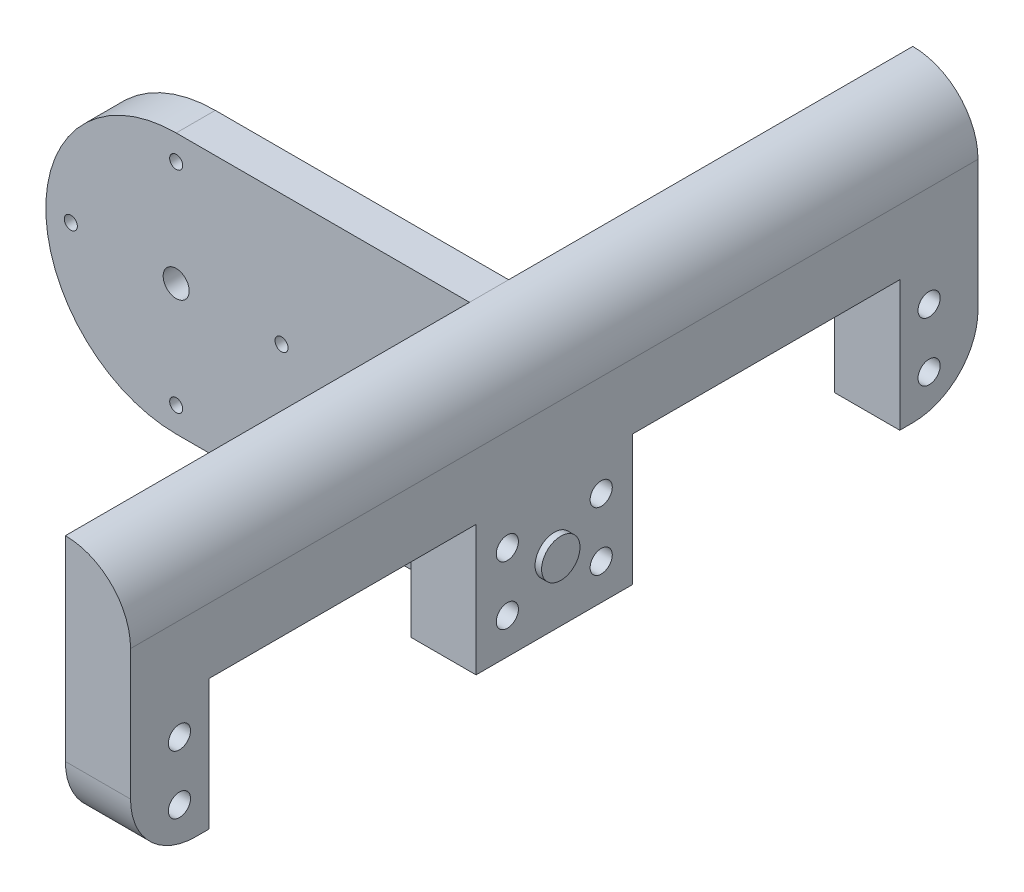
ISO-10303-21;
HEADER;
FILE_DESCRIPTION(('STEP AP214'),'2;1');
FILE_NAME('part.step','',(''),(''),'','','');
FILE_SCHEMA(('AUTOMOTIVE_DESIGN { 1 0 10303 214 1 1 1 1 }'));
ENDSEC;
DATA;
#1=APPLICATION_CONTEXT('core data for automotive mechanical design processes');
#2=APPLICATION_PROTOCOL_DEFINITION('international standard','automotive_design',2000,#1);
#3=PRODUCT_CONTEXT('',#1,'mechanical');
#4=PRODUCT('Part','Part','',(#3));
#5=PRODUCT_RELATED_PRODUCT_CATEGORY('part','',(#4));
#6=PRODUCT_DEFINITION_FORMATION('','',#4);
#7=PRODUCT_DEFINITION_CONTEXT('part definition',#1,'design');
#8=PRODUCT_DEFINITION('design','',#6,#7);
#9=PRODUCT_DEFINITION_SHAPE('','',#8);
#10=(LENGTH_UNIT() NAMED_UNIT(*) SI_UNIT(.MILLI.,.METRE.));
#11=(NAMED_UNIT(*) PLANE_ANGLE_UNIT() SI_UNIT($,.RADIAN.));
#12=(NAMED_UNIT(*) SI_UNIT($,.STERADIAN.) SOLID_ANGLE_UNIT());
#13=UNCERTAINTY_MEASURE_WITH_UNIT(LENGTH_MEASURE(1.E-05),#10,'distance_accuracy_value','');
#14=(GEOMETRIC_REPRESENTATION_CONTEXT(3) GLOBAL_UNCERTAINTY_ASSIGNED_CONTEXT((#13)) GLOBAL_UNIT_ASSIGNED_CONTEXT((#10,
#11,#12)) REPRESENTATION_CONTEXT('',''));
#15=CARTESIAN_POINT('',(0.,0.,0.));
#16=DIRECTION('',(0.,0.,1.));
#17=DIRECTION('',(1.,0.,0.));
#18=AXIS2_PLACEMENT_3D('',#15,#16,#17);
#19=CARTESIAN_POINT('',(55.,0.,0.));
#20=DIRECTION('',(-1.,0.,0.));
#21=DIRECTION('',(0.,0.,1.));
#22=AXIS2_PLACEMENT_3D('',#19,#20,#21);
#23=PLANE('',#22);
#24=CARTESIAN_POINT('',(55.,-9.99999999999046,-4.16680578929673E-12));
#25=DIRECTION('',(-1.,0.,0.));
#26=DIRECTION('',(0.,0.,1.));
#27=AXIS2_PLACEMENT_3D('',#24,#25,#26);
#28=CIRCLE('',#27,2.94441964631571);
#29=CARTESIAN_POINT('',(55.,-9.99999999999046,2.94441964631154));
#30=VERTEX_POINT('',#29);
#31=EDGE_CURVE('E11',#30,#30,#28,.F.);
#32=ORIENTED_EDGE('',*,*,#31,.F.);
#33=EDGE_LOOP('',(#32));
#34=FACE_BOUND('',#33,.T.);
#35=CARTESIAN_POINT('',(55.,-14.5,-7.20000000000033));
#36=DIRECTION('',(1.,0.,0.));
#37=DIRECTION('',(0.,0.,-1.));
#38=AXIS2_PLACEMENT_3D('',#35,#36,#37);
#39=CIRCLE('',#38,1.69999999999999);
#40=CARTESIAN_POINT('',(55.,-14.5,-8.90000000000032));
#41=VERTEX_POINT('',#40);
#42=EDGE_CURVE('E714',#41,#41,#39,.T.);
#43=ORIENTED_EDGE('',*,*,#42,.F.);
#44=EDGE_LOOP('',(#43));
#45=FACE_BOUND('',#44,.T.);
#46=DIRECTION('',(0.,0.,-1.));
#47=VECTOR('',#46,1.);
#48=CARTESIAN_POINT('',(55.,-20.,-65.));
#49=LINE('',#48,#47);
#50=CARTESIAN_POINT('',(55.,-20.,-53.));
#51=VERTEX_POINT('',#50);
#52=CARTESIAN_POINT('',(55.,-20.,-55.));
#53=VERTEX_POINT('',#52);
#54=EDGE_CURVE('E234',#51,#53,#49,.T.);
#55=ORIENTED_EDGE('',*,*,#54,.T.);
#56=CARTESIAN_POINT('',(55.,-9.99999999999997,-55.));
#57=DIRECTION('',(-1.,0.,0.));
#58=DIRECTION('',(0.,0.,1.));
#59=AXIS2_PLACEMENT_3D('',#56,#57,#58);
#60=CIRCLE('',#59,10.);
#61=CARTESIAN_POINT('',(55.,-9.99999999999997,-65.));
#62=VERTEX_POINT('',#61);
#63=EDGE_CURVE('E322',#53,#62,#60,.F.);
#64=ORIENTED_EDGE('',*,*,#63,.T.);
#65=DIRECTION('',(0.,1.,0.));
#66=VECTOR('',#65,1.);
#67=CARTESIAN_POINT('',(55.,20.,-65.));
#68=LINE('',#67,#66);
#69=CARTESIAN_POINT('',(55.,9.99999999999998,-65.));
#70=VERTEX_POINT('',#69);
#71=EDGE_CURVE('E165',#62,#70,#68,.T.);
#72=ORIENTED_EDGE('',*,*,#71,.T.);
#73=DIRECTION('',(0.,0.,1.));
#74=VECTOR('',#73,1.);
#75=CARTESIAN_POINT('',(55.,9.99999999999998,65.));
#76=LINE('',#75,#74);
#77=CARTESIAN_POINT('',(55.,9.99999999999998,65.));
#78=VERTEX_POINT('',#77);
#79=EDGE_CURVE('E302',#70,#78,#76,.T.);
#80=ORIENTED_EDGE('',*,*,#79,.T.);
#81=DIRECTION('',(0.,-1.,0.));
#82=VECTOR('',#81,1.);
#83=CARTESIAN_POINT('',(55.,20.,65.));
#84=LINE('',#83,#82);
#85=CARTESIAN_POINT('',(55.,-9.99999999999997,65.));
#86=VERTEX_POINT('',#85);
#87=EDGE_CURVE('E231',#78,#86,#84,.T.);
#88=ORIENTED_EDGE('',*,*,#87,.T.);
#89=CARTESIAN_POINT('',(55.,-9.99999999999997,55.));
#90=DIRECTION('',(-1.,0.,0.));
#91=DIRECTION('',(0.,0.,1.));
#92=AXIS2_PLACEMENT_3D('',#89,#90,#91);
#93=CIRCLE('',#92,10.);
#94=CARTESIAN_POINT('',(55.,-20.,55.));
#95=VERTEX_POINT('',#94);
#96=EDGE_CURVE('E320',#86,#95,#93,.F.);
#97=ORIENTED_EDGE('',*,*,#96,.T.);
#98=CARTESIAN_POINT('',(55.,-20.,53.));
#99=VERTEX_POINT('',#98);
#100=EDGE_CURVE('E235',#95,#99,#49,.T.);
#101=ORIENTED_EDGE('',*,*,#100,.T.);
#102=DIRECTION('',(0.,-1.,0.));
#103=VECTOR('',#102,1.);
#104=CARTESIAN_POINT('',(55.,-20.,53.));
#105=LINE('',#104,#103);
#106=CARTESIAN_POINT('',(55.,0.,53.));
#107=VERTEX_POINT('',#106);
#108=EDGE_CURVE('E176',#107,#99,#105,.T.);
#109=ORIENTED_EDGE('',*,*,#108,.F.);
#110=DIRECTION('',(0.,0.,1.));
#111=VECTOR('',#110,1.);
#112=CARTESIAN_POINT('',(55.,0.,53.));
#113=LINE('',#112,#111);
#114=CARTESIAN_POINT('',(55.,0.,12.));
#115=VERTEX_POINT('',#114);
#116=EDGE_CURVE('E184',#115,#107,#113,.T.);
#117=ORIENTED_EDGE('',*,*,#116,.F.);
#118=DIRECTION('',(0.,1.,0.));
#119=VECTOR('',#118,1.);
#120=CARTESIAN_POINT('',(55.,-20.,12.));
#121=LINE('',#120,#119);
#122=CARTESIAN_POINT('',(55.,-20.,12.));
#123=VERTEX_POINT('',#122);
#124=EDGE_CURVE('E188',#123,#115,#121,.T.);
#125=ORIENTED_EDGE('',*,*,#124,.F.);
#126=CARTESIAN_POINT('',(55.,-20.,-12.));
#127=VERTEX_POINT('',#126);
#128=EDGE_CURVE('E238',#123,#127,#49,.T.);
#129=ORIENTED_EDGE('',*,*,#128,.T.);
#130=DIRECTION('',(0.,-1.,0.));
#131=VECTOR('',#130,1.);
#132=CARTESIAN_POINT('',(55.,-20.,-12.));
#133=LINE('',#132,#131);
#134=CARTESIAN_POINT('',(55.,0.,-12.));
#135=VERTEX_POINT('',#134);
#136=EDGE_CURVE('E209',#135,#127,#133,.T.);
#137=ORIENTED_EDGE('',*,*,#136,.F.);
#138=DIRECTION('',(0.,0.,1.));
#139=VECTOR('',#138,1.);
#140=CARTESIAN_POINT('',(55.,0.,-53.));
#141=LINE('',#140,#139);
#142=CARTESIAN_POINT('',(55.,0.,-53.));
#143=VERTEX_POINT('',#142);
#144=EDGE_CURVE('E219',#143,#135,#141,.T.);
#145=ORIENTED_EDGE('',*,*,#144,.F.);
#146=DIRECTION('',(0.,1.,0.));
#147=VECTOR('',#146,1.);
#148=CARTESIAN_POINT('',(55.,-20.,-53.));
#149=LINE('',#148,#147);
#150=EDGE_CURVE('E216',#51,#143,#149,.T.);
#151=ORIENTED_EDGE('',*,*,#150,.F.);
#152=EDGE_LOOP('',(#55,#64,#72,#80,#88,#97,#101,#109,#117,#125,#129,#137,#145,#151));
#153=FACE_BOUND('',#152,.T.);
#154=CARTESIAN_POINT('',(55.,-14.4999999999998,-57.5000000000004));
#155=DIRECTION('',(1.,0.,0.));
#156=DIRECTION('',(0.,0.,-1.));
#157=AXIS2_PLACEMENT_3D('',#154,#155,#156);
#158=CIRCLE('',#157,1.69999999999999);
#159=CARTESIAN_POINT('',(55.,-14.4999999999998,-59.2000000000004));
#160=VERTEX_POINT('',#159);
#161=EDGE_CURVE('E725',#160,#160,#158,.T.);
#162=ORIENTED_EDGE('',*,*,#161,.F.);
#163=EDGE_LOOP('',(#162));
#164=FACE_BOUND('',#163,.T.);
#165=CARTESIAN_POINT('',(55.,-5.4999999999998,-57.5000000000004));
#166=DIRECTION('',(1.,0.,0.));
#167=DIRECTION('',(0.,0.,-1.));
#168=AXIS2_PLACEMENT_3D('',#165,#166,#167);
#169=CIRCLE('',#168,1.69999999999999);
#170=CARTESIAN_POINT('',(55.,-5.4999999999998,-59.2000000000004));
#171=VERTEX_POINT('',#170);
#172=EDGE_CURVE('E720',#171,#171,#169,.T.);
#173=ORIENTED_EDGE('',*,*,#172,.F.);
#174=EDGE_LOOP('',(#173));
#175=FACE_BOUND('',#174,.T.);
#176=CARTESIAN_POINT('',(55.,-5.49999999999998,-7.20000000000033));
#177=DIRECTION('',(1.,0.,0.));
#178=DIRECTION('',(0.,0.,-1.));
#179=AXIS2_PLACEMENT_3D('',#176,#177,#178);
#180=CIRCLE('',#179,1.69999999999999);
#181=CARTESIAN_POINT('',(55.,-5.49999999999998,-8.90000000000032));
#182=VERTEX_POINT('',#181);
#183=EDGE_CURVE('E708',#182,#182,#180,.T.);
#184=ORIENTED_EDGE('',*,*,#183,.F.);
#185=EDGE_LOOP('',(#184));
#186=FACE_BOUND('',#185,.T.);
#187=CARTESIAN_POINT('',(55.,-14.5000000000001,7.19999999999994));
#188=DIRECTION('',(1.,0.,0.));
#189=DIRECTION('',(0.,0.,-1.));
#190=AXIS2_PLACEMENT_3D('',#187,#188,#189);
#191=CIRCLE('',#190,1.69999999999999);
#192=CARTESIAN_POINT('',(55.,-14.5000000000001,5.49999999999995));
#193=VERTEX_POINT('',#192);
#194=EDGE_CURVE('E702',#193,#193,#191,.T.);
#195=ORIENTED_EDGE('',*,*,#194,.F.);
#196=EDGE_LOOP('',(#195));
#197=FACE_BOUND('',#196,.T.);
#198=CARTESIAN_POINT('',(55.,-5.50000000000013,7.1999999999998));
#199=DIRECTION('',(1.,0.,0.));
#200=DIRECTION('',(0.,0.,-1.));
#201=AXIS2_PLACEMENT_3D('',#198,#199,#200);
#202=CIRCLE('',#201,1.69999999999999);
#203=CARTESIAN_POINT('',(55.,-5.50000000000013,5.49999999999981));
#204=VERTEX_POINT('',#203);
#205=EDGE_CURVE('E696',#204,#204,#202,.T.);
#206=ORIENTED_EDGE('',*,*,#205,.F.);
#207=EDGE_LOOP('',(#206));
#208=FACE_BOUND('',#207,.T.);
#209=CARTESIAN_POINT('',(55.,-14.5000000000003,57.4999999999999));
#210=DIRECTION('',(1.,0.,0.));
#211=DIRECTION('',(0.,0.,-1.));
#212=AXIS2_PLACEMENT_3D('',#209,#210,#211);
#213=CIRCLE('',#212,1.69999999999999);
#214=CARTESIAN_POINT('',(55.,-14.5000000000003,55.7999999999999));
#215=VERTEX_POINT('',#214);
#216=EDGE_CURVE('E690',#215,#215,#213,.T.);
#217=ORIENTED_EDGE('',*,*,#216,.F.);
#218=EDGE_LOOP('',(#217));
#219=FACE_BOUND('',#218,.T.);
#220=CARTESIAN_POINT('',(55.,-5.50000000000031,57.4999999999999));
#221=DIRECTION('',(1.,0.,0.));
#222=DIRECTION('',(0.,0.,-1.));
#223=AXIS2_PLACEMENT_3D('',#220,#221,#222);
#224=CIRCLE('',#223,1.69999999999999);
#225=CARTESIAN_POINT('',(55.,-5.50000000000031,55.7999999999999));
#226=VERTEX_POINT('',#225);
#227=EDGE_CURVE('E682',#226,#226,#224,.T.);
#228=ORIENTED_EDGE('',*,*,#227,.F.);
#229=EDGE_LOOP('',(#228));
#230=FACE_BOUND('',#229,.T.);
#231=ADVANCED_FACE('F33',(#34,#45,#153,#164,#175,#186,#197,#208,#219,#230),#23,.F.);
#232=CARTESIAN_POINT('',(0.,-20.,-3.));
#233=DIRECTION('',(0.,-1.,0.));
#234=DIRECTION('',(1.,0.,0.));
#235=AXIS2_PLACEMENT_3D('',#232,#233,#234);
#236=PLANE('',#235);
#237=ORIENTED_EDGE('',*,*,#100,.F.);
#238=DIRECTION('',(-1.,0.,0.));
#239=VECTOR('',#238,1.);
#240=CARTESIAN_POINT('',(45.,-20.,55.));
#241=LINE('',#240,#239);
#242=CARTESIAN_POINT('',(45.,-20.,55.));
#243=VERTEX_POINT('',#242);
#244=EDGE_CURVE('E163',#95,#243,#241,.T.);
#245=ORIENTED_EDGE('',*,*,#244,.T.);
#246=DIRECTION('',(0.,0.,-1.));
#247=VECTOR('',#246,1.);
#248=CARTESIAN_POINT('',(45.,-20.,-65.));
#249=LINE('',#248,#247);
#250=CARTESIAN_POINT('',(45.,-20.,53.));
#251=VERTEX_POINT('',#250);
#252=EDGE_CURVE('E158',#243,#251,#249,.T.);
#253=ORIENTED_EDGE('',*,*,#252,.T.);
#254=DIRECTION('',(1.,0.,0.));
#255=VECTOR('',#254,1.);
#256=CARTESIAN_POINT('',(45.,-20.,53.));
#257=LINE('',#256,#255);
#258=EDGE_CURVE('E162',#251,#99,#257,.T.);
#259=ORIENTED_EDGE('',*,*,#258,.T.);
#260=EDGE_LOOP('',(#237,#245,#253,#259));
#261=FACE_BOUND('',#260,.T.);
#262=ADVANCED_FACE('F161',(#261),#236,.T.);
#263=CARTESIAN_POINT('',(45.,-20.,-53.));
#264=VERTEX_POINT('',#263);
#265=CARTESIAN_POINT('',(45.,-20.,-55.));
#266=VERTEX_POINT('',#265);
#267=EDGE_CURVE('E245',#264,#266,#249,.T.);
#268=ORIENTED_EDGE('',*,*,#267,.T.);
#269=DIRECTION('',(-1.,0.,0.));
#270=VECTOR('',#269,1.);
#271=CARTESIAN_POINT('',(55.,-20.,-55.));
#272=LINE('',#271,#270);
#273=EDGE_CURVE('E318',#266,#53,#272,.F.);
#274=ORIENTED_EDGE('',*,*,#273,.T.);
#275=ORIENTED_EDGE('',*,*,#54,.F.);
#276=DIRECTION('',(1.,0.,0.));
#277=VECTOR('',#276,1.);
#278=CARTESIAN_POINT('',(45.,-20.,-53.));
#279=LINE('',#278,#277);
#280=EDGE_CURVE('E196',#264,#51,#279,.T.);
#281=ORIENTED_EDGE('',*,*,#280,.F.);
#282=EDGE_LOOP('',(#268,#274,#275,#281));
#283=FACE_BOUND('',#282,.T.);
#284=ADVANCED_FACE('F352',(#283),#236,.T.);
#285=CARTESIAN_POINT('',(0.,0.,-3.));
#286=DIRECTION('',(0.,0.,1.));
#287=DIRECTION('',(1.,0.,0.));
#288=AXIS2_PLACEMENT_3D('',#285,#286,#287);
#289=CYLINDRICAL_SURFACE('',#288,20.);
#290=DIRECTION('',(0.,0.,1.));
#291=VECTOR('',#290,1.);
#292=CARTESIAN_POINT('',(0.,-20.,-3.));
#293=LINE('',#292,#291);
#294=CARTESIAN_POINT('',(0.,-20.,-3.));
#295=VERTEX_POINT('',#294);
#296=CARTESIAN_POINT('',(0.,-20.,3.));
#297=VERTEX_POINT('',#296);
#298=EDGE_CURVE('E299',#295,#297,#293,.T.);
#299=ORIENTED_EDGE('',*,*,#298,.T.);
#300=CARTESIAN_POINT('',(0.,0.,3.));
#301=DIRECTION('',(0.,0.,1.));
#302=DIRECTION('',(1.,0.,0.));
#303=AXIS2_PLACEMENT_3D('',#300,#301,#302);
#304=CIRCLE('',#303,20.);
#305=CARTESIAN_POINT('',(0.,20.,3.));
#306=VERTEX_POINT('',#305);
#307=EDGE_CURVE('E261',#306,#297,#304,.T.);
#308=ORIENTED_EDGE('',*,*,#307,.F.);
#309=DIRECTION('',(0.,0.,1.));
#310=VECTOR('',#309,1.);
#311=CARTESIAN_POINT('',(0.,20.,-3.));
#312=LINE('',#311,#310);
#313=CARTESIAN_POINT('',(0.,20.,-3.));
#314=VERTEX_POINT('',#313);
#315=EDGE_CURVE('E300',#314,#306,#312,.T.);
#316=ORIENTED_EDGE('',*,*,#315,.F.);
#317=CARTESIAN_POINT('',(0.,0.,-3.));
#318=DIRECTION('',(0.,0.,1.));
#319=DIRECTION('',(1.,0.,0.));
#320=AXIS2_PLACEMENT_3D('',#317,#318,#319);
#321=CIRCLE('',#320,20.);
#322=EDGE_CURVE('E287',#314,#295,#321,.T.);
#323=ORIENTED_EDGE('',*,*,#322,.T.);
#324=EDGE_LOOP('',(#299,#308,#316,#323));
#325=FACE_BOUND('',#324,.T.);
#326=ADVANCED_FACE('F401',(#325),#289,.T.);
#327=CARTESIAN_POINT('',(0.,20.,-3.));
#328=DIRECTION('',(0.,1.,0.));
#329=DIRECTION('',(-1.,0.,0.));
#330=AXIS2_PLACEMENT_3D('',#327,#328,#329);
#331=PLANE('',#330);
#332=DIRECTION('',(-1.,0.,0.));
#333=VECTOR('',#332,1.);
#334=CARTESIAN_POINT('',(0.,20.,3.));
#335=LINE('',#334,#333);
#336=CARTESIAN_POINT('',(45.,20.,3.));
#337=VERTEX_POINT('',#336);
#338=EDGE_CURVE('E269',#337,#306,#335,.T.);
#339=ORIENTED_EDGE('',*,*,#338,.F.);
#340=DIRECTION('',(0.,0.,1.));
#341=VECTOR('',#340,1.);
#342=CARTESIAN_POINT('',(45.,20.,-65.));
#343=LINE('',#342,#341);
#344=CARTESIAN_POINT('',(45.,20.,-3.));
#345=VERTEX_POINT('',#344);
#346=EDGE_CURVE('E308',#337,#345,#343,.F.);
#347=ORIENTED_EDGE('',*,*,#346,.T.);
#348=DIRECTION('',(-1.,0.,0.));
#349=VECTOR('',#348,1.);
#350=CARTESIAN_POINT('',(0.,20.,-3.));
#351=LINE('',#350,#349);
#352=EDGE_CURVE('E296',#345,#314,#351,.T.);
#353=ORIENTED_EDGE('',*,*,#352,.T.);
#354=ORIENTED_EDGE('',*,*,#315,.T.);
#355=EDGE_LOOP('',(#339,#347,#353,#354));
#356=FACE_BOUND('',#355,.T.);
#357=ADVANCED_FACE('F399',(#356),#331,.T.);
#358=DIRECTION('',(1.,0.,0.));
#359=VECTOR('',#358,1.);
#360=CARTESIAN_POINT('',(45.,-20.,12.));
#361=LINE('',#360,#359);
#362=CARTESIAN_POINT('',(45.,-20.,12.));
#363=VERTEX_POINT('',#362);
#364=EDGE_CURVE('E177',#363,#123,#361,.T.);
#365=ORIENTED_EDGE('',*,*,#364,.F.);
#366=CARTESIAN_POINT('',(45.,-20.,3.));
#367=VERTEX_POINT('',#366);
#368=EDGE_CURVE('E166',#363,#367,#249,.T.);
#369=ORIENTED_EDGE('',*,*,#368,.T.);
#370=DIRECTION('',(1.,0.,0.));
#371=VECTOR('',#370,1.);
#372=CARTESIAN_POINT('',(0.,-20.,3.));
#373=LINE('',#372,#371);
#374=EDGE_CURVE('E264',#297,#367,#373,.T.);
#375=ORIENTED_EDGE('',*,*,#374,.F.);
#376=ORIENTED_EDGE('',*,*,#298,.F.);
#377=DIRECTION('',(1.,0.,0.));
#378=VECTOR('',#377,1.);
#379=CARTESIAN_POINT('',(0.,-20.,-3.));
#380=LINE('',#379,#378);
#381=CARTESIAN_POINT('',(45.,-20.,-3.));
#382=VERTEX_POINT('',#381);
#383=EDGE_CURVE('E290',#295,#382,#380,.T.);
#384=ORIENTED_EDGE('',*,*,#383,.T.);
#385=CARTESIAN_POINT('',(45.,-20.,-12.));
#386=VERTEX_POINT('',#385);
#387=EDGE_CURVE('E168',#382,#386,#249,.T.);
#388=ORIENTED_EDGE('',*,*,#387,.T.);
#389=DIRECTION('',(1.,0.,0.));
#390=VECTOR('',#389,1.);
#391=CARTESIAN_POINT('',(45.,-20.,-12.));
#392=LINE('',#391,#390);
#393=EDGE_CURVE('E224',#386,#127,#392,.T.);
#394=ORIENTED_EDGE('',*,*,#393,.T.);
#395=ORIENTED_EDGE('',*,*,#128,.F.);
#396=EDGE_LOOP('',(#365,#369,#375,#376,#384,#388,#394,#395));
#397=FACE_BOUND('',#396,.T.);
#398=ADVANCED_FACE('F354',(#397),#236,.T.);
#399=CARTESIAN_POINT('',(0.,0.,-3.));
#400=DIRECTION('',(0.,0.,1.));
#401=DIRECTION('',(1.,0.,0.));
#402=AXIS2_PLACEMENT_3D('',#399,#400,#401);
#403=PLANE('',#402);
#404=CARTESIAN_POINT('',(-16.1599999999995,-4.59294824395329E-13,-3.));
#405=DIRECTION('',(0.,0.,1.));
#406=DIRECTION('',(1.,0.,0.));
#407=AXIS2_PLACEMENT_3D('',#404,#405,#406);
#408=CIRCLE('',#407,1.00000000000074);
#409=CARTESIAN_POINT('',(-15.1599999999988,-4.59294824395329E-13,-3.));
#410=VERTEX_POINT('',#409);
#411=EDGE_CURVE('E272',#410,#410,#408,.T.);
#412=ORIENTED_EDGE('',*,*,#411,.T.);
#413=EDGE_LOOP('',(#412));
#414=FACE_BOUND('',#413,.T.);
#415=CARTESIAN_POINT('',(9.15101854706686E-13,-16.16,-3.));
#416=DIRECTION('',(0.,0.,1.));
#417=DIRECTION('',(1.,0.,0.));
#418=AXIS2_PLACEMENT_3D('',#415,#416,#417);
#419=CIRCLE('',#418,1.00000000000098);
#420=CARTESIAN_POINT('',(1.0000000000019,-16.16,-3.));
#421=VERTEX_POINT('',#420);
#422=EDGE_CURVE('E275',#421,#421,#419,.T.);
#423=ORIENTED_EDGE('',*,*,#422,.T.);
#424=EDGE_LOOP('',(#423));
#425=FACE_BOUND('',#424,.T.);
#426=CARTESIAN_POINT('',(16.1600000000005,4.57315795167907E-13,-3.));
#427=DIRECTION('',(0.,0.,1.));
#428=DIRECTION('',(1.,0.,0.));
#429=AXIS2_PLACEMENT_3D('',#426,#427,#428);
#430=CIRCLE('',#429,1.00000000000036);
#431=CARTESIAN_POINT('',(17.1600000000008,4.57315795167907E-13,-3.));
#432=VERTEX_POINT('',#431);
#433=EDGE_CURVE('E278',#432,#432,#430,.T.);
#434=ORIENTED_EDGE('',*,*,#433,.T.);
#435=EDGE_LOOP('',(#434));
#436=FACE_BOUND('',#435,.T.);
#437=CARTESIAN_POINT('',(0.,16.16,-3.));
#438=DIRECTION('',(0.,0.,1.));
#439=DIRECTION('',(1.,0.,0.));
#440=AXIS2_PLACEMENT_3D('',#437,#438,#439);
#441=CIRCLE('',#440,1.);
#442=CARTESIAN_POINT('',(1.,16.16,-3.));
#443=VERTEX_POINT('',#442);
#444=EDGE_CURVE('E281',#443,#443,#441,.T.);
#445=ORIENTED_EDGE('',*,*,#444,.T.);
#446=EDGE_LOOP('',(#445));
#447=FACE_BOUND('',#446,.T.);
#448=CARTESIAN_POINT('',(0.,0.,-3.));
#449=DIRECTION('',(0.,0.,1.));
#450=DIRECTION('',(1.,0.,0.));
#451=AXIS2_PLACEMENT_3D('',#448,#449,#450);
#452=CIRCLE('',#451,2.);
#453=CARTESIAN_POINT('',(2.,0.,-3.));
#454=VERTEX_POINT('',#453);
#455=EDGE_CURVE('E284',#454,#454,#452,.T.);
#456=ORIENTED_EDGE('',*,*,#455,.T.);
#457=EDGE_LOOP('',(#456));
#458=FACE_BOUND('',#457,.T.);
#459=ORIENTED_EDGE('',*,*,#322,.F.);
#460=ORIENTED_EDGE('',*,*,#352,.F.);
#461=DIRECTION('',(0.,1.,0.));
#462=VECTOR('',#461,1.);
#463=CARTESIAN_POINT('',(45.,20.,-3.));
#464=LINE('',#463,#462);
#465=EDGE_CURVE('E293',#382,#345,#464,.T.);
#466=ORIENTED_EDGE('',*,*,#465,.F.);
#467=ORIENTED_EDGE('',*,*,#383,.F.);
#468=EDGE_LOOP('',(#459,#460,#466,#467));
#469=FACE_BOUND('',#468,.T.);
#470=ADVANCED_FACE('F394',(#414,#425,#436,#447,#458,#469),#403,.F.);
#471=CARTESIAN_POINT('',(0.,0.,-3.));
#472=DIRECTION('',(0.,0.,1.));
#473=DIRECTION('',(1.,0.,0.));
#474=AXIS2_PLACEMENT_3D('',#471,#472,#473);
#475=CYLINDRICAL_SURFACE('',#474,2.);
#476=ORIENTED_EDGE('',*,*,#455,.F.);
#477=EDGE_LOOP('',(#476));
#478=FACE_BOUND('',#477,.T.);
#479=CARTESIAN_POINT('',(0.,0.,3.));
#480=DIRECTION('',(0.,0.,1.));
#481=DIRECTION('',(1.,0.,0.));
#482=AXIS2_PLACEMENT_3D('',#479,#480,#481);
#483=CIRCLE('',#482,2.);
#484=CARTESIAN_POINT('',(2.,0.,3.));
#485=VERTEX_POINT('',#484);
#486=EDGE_CURVE('E258',#485,#485,#483,.T.);
#487=ORIENTED_EDGE('',*,*,#486,.T.);
#488=EDGE_LOOP('',(#487));
#489=FACE_BOUND('',#488,.T.);
#490=ADVANCED_FACE('F390',(#478,#489),#475,.F.);
#491=CARTESIAN_POINT('',(0.,16.16,-3.));
#492=DIRECTION('',(0.,0.,1.));
#493=DIRECTION('',(1.,0.,0.));
#494=AXIS2_PLACEMENT_3D('',#491,#492,#493);
#495=CYLINDRICAL_SURFACE('',#494,1.);
#496=ORIENTED_EDGE('',*,*,#444,.F.);
#497=EDGE_LOOP('',(#496));
#498=FACE_BOUND('',#497,.T.);
#499=CARTESIAN_POINT('',(0.,16.16,3.));
#500=DIRECTION('',(0.,0.,1.));
#501=DIRECTION('',(1.,0.,0.));
#502=AXIS2_PLACEMENT_3D('',#499,#500,#501);
#503=CIRCLE('',#502,1.);
#504=CARTESIAN_POINT('',(1.,16.16,3.));
#505=VERTEX_POINT('',#504);
#506=EDGE_CURVE('E255',#505,#505,#503,.T.);
#507=ORIENTED_EDGE('',*,*,#506,.T.);
#508=EDGE_LOOP('',(#507));
#509=FACE_BOUND('',#508,.T.);
#510=ADVANCED_FACE('F386',(#498,#509),#495,.F.);
#511=CARTESIAN_POINT('',(16.1600000000005,4.57315795167907E-13,-3.));
#512=DIRECTION('',(0.,0.,1.));
#513=DIRECTION('',(1.,0.,0.));
#514=AXIS2_PLACEMENT_3D('',#511,#512,#513);
#515=CYLINDRICAL_SURFACE('',#514,1.00000000000036);
#516=ORIENTED_EDGE('',*,*,#433,.F.);
#517=EDGE_LOOP('',(#516));
#518=FACE_BOUND('',#517,.T.);
#519=CARTESIAN_POINT('',(16.1600000000005,4.57315795167907E-13,3.));
#520=DIRECTION('',(0.,0.,1.));
#521=DIRECTION('',(1.,0.,0.));
#522=AXIS2_PLACEMENT_3D('',#519,#520,#521);
#523=CIRCLE('',#522,1.00000000000036);
#524=CARTESIAN_POINT('',(17.1600000000008,4.57315795167907E-13,3.));
#525=VERTEX_POINT('',#524);
#526=EDGE_CURVE('E252',#525,#525,#523,.T.);
#527=ORIENTED_EDGE('',*,*,#526,.T.);
#528=EDGE_LOOP('',(#527));
#529=FACE_BOUND('',#528,.T.);
#530=ADVANCED_FACE('F382',(#518,#529),#515,.F.);
#531=CARTESIAN_POINT('',(9.15101854706686E-13,-16.16,-3.));
#532=DIRECTION('',(0.,0.,1.));
#533=DIRECTION('',(1.,0.,0.));
#534=AXIS2_PLACEMENT_3D('',#531,#532,#533);
#535=CYLINDRICAL_SURFACE('',#534,1.00000000000098);
#536=ORIENTED_EDGE('',*,*,#422,.F.);
#537=EDGE_LOOP('',(#536));
#538=FACE_BOUND('',#537,.T.);
#539=CARTESIAN_POINT('',(9.15101854706686E-13,-16.16,3.));
#540=DIRECTION('',(0.,0.,1.));
#541=DIRECTION('',(1.,0.,0.));
#542=AXIS2_PLACEMENT_3D('',#539,#540,#541);
#543=CIRCLE('',#542,1.00000000000098);
#544=CARTESIAN_POINT('',(1.0000000000019,-16.16,3.));
#545=VERTEX_POINT('',#544);
#546=EDGE_CURVE('E249',#545,#545,#543,.T.);
#547=ORIENTED_EDGE('',*,*,#546,.T.);
#548=EDGE_LOOP('',(#547));
#549=FACE_BOUND('',#548,.T.);
#550=ADVANCED_FACE('F378',(#538,#549),#535,.F.);
#551=CARTESIAN_POINT('',(-16.1599999999995,-4.59294824395329E-13,-3.));
#552=DIRECTION('',(0.,0.,1.));
#553=DIRECTION('',(1.,0.,0.));
#554=AXIS2_PLACEMENT_3D('',#551,#552,#553);
#555=CYLINDRICAL_SURFACE('',#554,1.00000000000074);
#556=ORIENTED_EDGE('',*,*,#411,.F.);
#557=EDGE_LOOP('',(#556));
#558=FACE_BOUND('',#557,.T.);
#559=CARTESIAN_POINT('',(-16.1599999999995,-4.59294824395329E-13,3.));
#560=DIRECTION('',(0.,0.,1.));
#561=DIRECTION('',(1.,0.,0.));
#562=AXIS2_PLACEMENT_3D('',#559,#560,#561);
#563=CIRCLE('',#562,1.00000000000074);
#564=CARTESIAN_POINT('',(-15.1599999999988,-4.59294824395329E-13,3.));
#565=VERTEX_POINT('',#564);
#566=EDGE_CURVE('E237',#565,#565,#563,.T.);
#567=ORIENTED_EDGE('',*,*,#566,.T.);
#568=EDGE_LOOP('',(#567));
#569=FACE_BOUND('',#568,.T.);
#570=ADVANCED_FACE('F374',(#558,#569),#555,.F.);
#571=CARTESIAN_POINT('',(0.,0.,3.));
#572=DIRECTION('',(0.,0.,1.));
#573=DIRECTION('',(1.,0.,0.));
#574=AXIS2_PLACEMENT_3D('',#571,#572,#573);
#575=PLANE('',#574);
#576=ORIENTED_EDGE('',*,*,#546,.F.);
#577=EDGE_LOOP('',(#576));
#578=FACE_BOUND('',#577,.T.);
#579=ORIENTED_EDGE('',*,*,#506,.F.);
#580=EDGE_LOOP('',(#579));
#581=FACE_BOUND('',#580,.T.);
#582=ORIENTED_EDGE('',*,*,#307,.T.);
#583=ORIENTED_EDGE('',*,*,#374,.T.);
#584=DIRECTION('',(0.,1.,0.));
#585=VECTOR('',#584,1.);
#586=CARTESIAN_POINT('',(45.,20.,3.));
#587=LINE('',#586,#585);
#588=EDGE_CURVE('E267',#367,#337,#587,.T.);
#589=ORIENTED_EDGE('',*,*,#588,.T.);
#590=ORIENTED_EDGE('',*,*,#338,.T.);
#591=EDGE_LOOP('',(#582,#583,#589,#590));
#592=FACE_BOUND('',#591,.T.);
#593=ORIENTED_EDGE('',*,*,#486,.F.);
#594=EDGE_LOOP('',(#593));
#595=FACE_BOUND('',#594,.T.);
#596=ORIENTED_EDGE('',*,*,#526,.F.);
#597=EDGE_LOOP('',(#596));
#598=FACE_BOUND('',#597,.T.);
#599=ORIENTED_EDGE('',*,*,#566,.F.);
#600=EDGE_LOOP('',(#599));
#601=FACE_BOUND('',#600,.T.);
#602=ADVANCED_FACE('F371',(#578,#581,#592,#595,#598,#601),#575,.T.);
#603=CARTESIAN_POINT('',(45.,0.,0.));
#604=DIRECTION('',(-1.,0.,0.));
#605=DIRECTION('',(0.,0.,1.));
#606=AXIS2_PLACEMENT_3D('',#603,#604,#605);
#607=PLANE('',#606);
#608=CARTESIAN_POINT('',(45.,-5.50000000000031,57.4999999999999));
#609=DIRECTION('',(-1.,0.,0.));
#610=DIRECTION('',(0.,0.,1.));
#611=AXIS2_PLACEMENT_3D('',#608,#609,#610);
#612=CIRCLE('',#611,1.69999999999999);
#613=CARTESIAN_POINT('',(45.,-5.50000000000031,59.1999999999999));
#614=VERTEX_POINT('',#613);
#615=EDGE_CURVE('E685',#614,#614,#612,.T.);
#616=ORIENTED_EDGE('',*,*,#615,.F.);
#617=EDGE_LOOP('',(#616));
#618=FACE_BOUND('',#617,.T.);
#619=CARTESIAN_POINT('',(45.,-14.5000000000003,57.4999999999999));
#620=DIRECTION('',(-1.,0.,0.));
#621=DIRECTION('',(0.,0.,1.));
#622=AXIS2_PLACEMENT_3D('',#619,#620,#621);
#623=CIRCLE('',#622,1.69999999999999);
#624=CARTESIAN_POINT('',(45.,-14.5000000000003,59.1999999999999));
#625=VERTEX_POINT('',#624);
#626=EDGE_CURVE('E693',#625,#625,#623,.T.);
#627=ORIENTED_EDGE('',*,*,#626,.F.);
#628=EDGE_LOOP('',(#627));
#629=FACE_BOUND('',#628,.T.);
#630=CARTESIAN_POINT('',(45.,-5.50000000000013,7.1999999999998));
#631=DIRECTION('',(-1.,0.,0.));
#632=DIRECTION('',(0.,0.,1.));
#633=AXIS2_PLACEMENT_3D('',#630,#631,#632);
#634=CIRCLE('',#633,1.69999999999999);
#635=CARTESIAN_POINT('',(45.,-5.50000000000013,8.89999999999979));
#636=VERTEX_POINT('',#635);
#637=EDGE_CURVE('E699',#636,#636,#634,.T.);
#638=ORIENTED_EDGE('',*,*,#637,.F.);
#639=EDGE_LOOP('',(#638));
#640=FACE_BOUND('',#639,.T.);
#641=CARTESIAN_POINT('',(45.,-14.5000000000001,7.19999999999994));
#642=DIRECTION('',(-1.,0.,0.));
#643=DIRECTION('',(0.,0.,1.));
#644=AXIS2_PLACEMENT_3D('',#641,#642,#643);
#645=CIRCLE('',#644,1.69999999999999);
#646=CARTESIAN_POINT('',(45.,-14.5000000000001,8.89999999999993));
#647=VERTEX_POINT('',#646);
#648=EDGE_CURVE('E705',#647,#647,#645,.T.);
#649=ORIENTED_EDGE('',*,*,#648,.F.);
#650=EDGE_LOOP('',(#649));
#651=FACE_BOUND('',#650,.T.);
#652=ORIENTED_EDGE('',*,*,#252,.F.);
#653=CARTESIAN_POINT('',(45.,-9.99999999999998,55.));
#654=DIRECTION('',(-1.,0.,0.));
#655=DIRECTION('',(0.,0.,1.));
#656=AXIS2_PLACEMENT_3D('',#653,#654,#655);
#657=CIRCLE('',#656,10.);
#658=CARTESIAN_POINT('',(45.,-9.99999999999997,65.));
#659=VERTEX_POINT('',#658);
#660=EDGE_CURVE('E48',#243,#659,#657,.T.);
#661=ORIENTED_EDGE('',*,*,#660,.T.);
#662=DIRECTION('',(0.,-1.,0.));
#663=VECTOR('',#662,1.);
#664=CARTESIAN_POINT('',(45.,20.,65.));
#665=LINE('',#664,#663);
#666=CARTESIAN_POINT('',(45.,20.,65.));
#667=VERTEX_POINT('',#666);
#668=EDGE_CURVE('E244',#667,#659,#665,.T.);
#669=ORIENTED_EDGE('',*,*,#668,.F.);
#670=DIRECTION('',(0.,0.,1.));
#671=VECTOR('',#670,1.);
#672=CARTESIAN_POINT('',(45.,20.,-65.));
#673=LINE('',#672,#671);
#674=EDGE_CURVE('E240',#337,#667,#673,.T.);
#675=ORIENTED_EDGE('',*,*,#674,.F.);
#676=ORIENTED_EDGE('',*,*,#588,.F.);
#677=ORIENTED_EDGE('',*,*,#368,.F.);
#678=DIRECTION('',(0.,1.,0.));
#679=VECTOR('',#678,1.);
#680=CARTESIAN_POINT('',(45.,-20.,12.));
#681=LINE('',#680,#679);
#682=CARTESIAN_POINT('',(45.,0.,12.));
#683=VERTEX_POINT('',#682);
#684=EDGE_CURVE('E183',#363,#683,#681,.T.);
#685=ORIENTED_EDGE('',*,*,#684,.T.);
#686=DIRECTION('',(0.,0.,1.));
#687=VECTOR('',#686,1.);
#688=CARTESIAN_POINT('',(45.,0.,53.));
#689=LINE('',#688,#687);
#690=CARTESIAN_POINT('',(45.,0.,53.));
#691=VERTEX_POINT('',#690);
#692=EDGE_CURVE('E178',#683,#691,#689,.T.);
#693=ORIENTED_EDGE('',*,*,#692,.T.);
#694=DIRECTION('',(0.,-1.,0.));
#695=VECTOR('',#694,1.);
#696=CARTESIAN_POINT('',(45.,-20.,53.));
#697=LINE('',#696,#695);
#698=EDGE_CURVE('E173',#691,#251,#697,.T.);
#699=ORIENTED_EDGE('',*,*,#698,.T.);
#700=EDGE_LOOP('',(#652,#661,#669,#675,#676,#677,#685,#693,#699));
#701=FACE_BOUND('',#700,.T.);
#702=ADVANCED_FACE('F180',(#618,#629,#640,#651,#701),#607,.T.);
#703=CARTESIAN_POINT('',(55.,20.,-65.));
#704=DIRECTION('',(0.,0.,1.));
#705=DIRECTION('',(0.,-1.,0.));
#706=AXIS2_PLACEMENT_3D('',#703,#704,#705);
#707=PLANE('',#706);
#708=ORIENTED_EDGE('',*,*,#71,.F.);
#709=DIRECTION('',(-1.,0.,0.));
#710=VECTOR('',#709,1.);
#711=CARTESIAN_POINT('',(45.,-9.99999999999997,-65.));
#712=LINE('',#711,#710);
#713=CARTESIAN_POINT('',(45.,-9.99999999999997,-65.));
#714=VERTEX_POINT('',#713);
#715=EDGE_CURVE('E313',#62,#714,#712,.T.);
#716=ORIENTED_EDGE('',*,*,#715,.T.);
#717=DIRECTION('',(0.,1.,0.));
#718=VECTOR('',#717,1.);
#719=CARTESIAN_POINT('',(45.,20.,-65.));
#720=LINE('',#719,#718);
#721=CARTESIAN_POINT('',(45.,20.,-65.));
#722=VERTEX_POINT('',#721);
#723=EDGE_CURVE('E201',#714,#722,#720,.T.);
#724=ORIENTED_EDGE('',*,*,#723,.T.);
#725=CARTESIAN_POINT('',(45.,9.99999999999998,-65.));
#726=DIRECTION('',(0.,0.,1.));
#727=DIRECTION('',(0.,-1.,0.));
#728=AXIS2_PLACEMENT_3D('',#725,#726,#727);
#729=CIRCLE('',#728,10.);
#730=EDGE_CURVE('E310',#722,#70,#729,.F.);
#731=ORIENTED_EDGE('',*,*,#730,.T.);
#732=EDGE_LOOP('',(#708,#716,#724,#731));
#733=FACE_BOUND('',#732,.T.);
#734=ADVANCED_FACE('F367',(#733),#707,.F.);
#735=CARTESIAN_POINT('',(55.,20.,65.));
#736=DIRECTION('',(0.,0.,-1.));
#737=DIRECTION('',(0.,1.,0.));
#738=AXIS2_PLACEMENT_3D('',#735,#736,#737);
#739=PLANE('',#738);
#740=ORIENTED_EDGE('',*,*,#668,.T.);
#741=DIRECTION('',(-1.,0.,0.));
#742=VECTOR('',#741,1.);
#743=CARTESIAN_POINT('',(55.,-9.99999999999997,65.));
#744=LINE('',#743,#742);
#745=EDGE_CURVE('E41',#659,#86,#744,.F.);
#746=ORIENTED_EDGE('',*,*,#745,.T.);
#747=ORIENTED_EDGE('',*,*,#87,.F.);
#748=CARTESIAN_POINT('',(45.,9.99999999999998,65.));
#749=DIRECTION('',(0.,0.,-1.));
#750=DIRECTION('',(0.,1.,0.));
#751=AXIS2_PLACEMENT_3D('',#748,#749,#750);
#752=CIRCLE('',#751,10.);
#753=EDGE_CURVE('E306',#78,#667,#752,.F.);
#754=ORIENTED_EDGE('',*,*,#753,.T.);
#755=EDGE_LOOP('',(#740,#746,#747,#754));
#756=FACE_BOUND('',#755,.T.);
#757=ADVANCED_FACE('F327',(#756),#739,.F.);
#758=CARTESIAN_POINT('',(45.,-5.49999999999998,-7.20000000000033));
#759=DIRECTION('',(-1.,0.,0.));
#760=DIRECTION('',(0.,0.,1.));
#761=AXIS2_PLACEMENT_3D('',#758,#759,#760);
#762=CIRCLE('',#761,1.69999999999999);
#763=CARTESIAN_POINT('',(45.,-5.49999999999998,-5.50000000000034));
#764=VERTEX_POINT('',#763);
#765=EDGE_CURVE('E711',#764,#764,#762,.T.);
#766=ORIENTED_EDGE('',*,*,#765,.F.);
#767=EDGE_LOOP('',(#766));
#768=FACE_BOUND('',#767,.T.);
#769=CARTESIAN_POINT('',(45.,-14.5,-7.20000000000033));
#770=DIRECTION('',(-1.,0.,0.));
#771=DIRECTION('',(0.,0.,1.));
#772=AXIS2_PLACEMENT_3D('',#769,#770,#771);
#773=CIRCLE('',#772,1.69999999999999);
#774=CARTESIAN_POINT('',(45.,-14.5,-5.50000000000034));
#775=VERTEX_POINT('',#774);
#776=EDGE_CURVE('E717',#775,#775,#773,.T.);
#777=ORIENTED_EDGE('',*,*,#776,.F.);
#778=EDGE_LOOP('',(#777));
#779=FACE_BOUND('',#778,.T.);
#780=CARTESIAN_POINT('',(45.,-5.4999999999998,-57.5000000000004));
#781=DIRECTION('',(-1.,0.,0.));
#782=DIRECTION('',(0.,0.,1.));
#783=AXIS2_PLACEMENT_3D('',#780,#781,#782);
#784=CIRCLE('',#783,1.69999999999999);
#785=CARTESIAN_POINT('',(45.,-5.4999999999998,-55.8000000000004));
#786=VERTEX_POINT('',#785);
#787=EDGE_CURVE('E723',#786,#786,#784,.T.);
#788=ORIENTED_EDGE('',*,*,#787,.F.);
#789=EDGE_LOOP('',(#788));
#790=FACE_BOUND('',#789,.T.);
#791=CARTESIAN_POINT('',(45.,-14.4999999999998,-57.5000000000004));
#792=DIRECTION('',(-1.,0.,0.));
#793=DIRECTION('',(0.,0.,1.));
#794=AXIS2_PLACEMENT_3D('',#791,#792,#793);
#795=CIRCLE('',#794,1.69999999999999);
#796=CARTESIAN_POINT('',(45.,-14.4999999999998,-55.8000000000004));
#797=VERTEX_POINT('',#796);
#798=EDGE_CURVE('E191',#797,#797,#795,.T.);
#799=ORIENTED_EDGE('',*,*,#798,.F.);
#800=EDGE_LOOP('',(#799));
#801=FACE_BOUND('',#800,.T.);
#802=ORIENTED_EDGE('',*,*,#723,.F.);
#803=CARTESIAN_POINT('',(45.,-9.99999999999998,-55.));
#804=DIRECTION('',(-1.,0.,0.));
#805=DIRECTION('',(0.,0.,1.));
#806=AXIS2_PLACEMENT_3D('',#803,#804,#805);
#807=CIRCLE('',#806,10.);
#808=EDGE_CURVE('E316',#714,#266,#807,.T.);
#809=ORIENTED_EDGE('',*,*,#808,.T.);
#810=ORIENTED_EDGE('',*,*,#267,.F.);
#811=DIRECTION('',(0.,1.,0.));
#812=VECTOR('',#811,1.);
#813=CARTESIAN_POINT('',(45.,-20.,-53.));
#814=LINE('',#813,#812);
#815=CARTESIAN_POINT('',(45.,0.,-53.));
#816=VERTEX_POINT('',#815);
#817=EDGE_CURVE('E205',#264,#816,#814,.T.);
#818=ORIENTED_EDGE('',*,*,#817,.T.);
#819=DIRECTION('',(0.,0.,1.));
#820=VECTOR('',#819,1.);
#821=CARTESIAN_POINT('',(45.,0.,-53.));
#822=LINE('',#821,#820);
#823=CARTESIAN_POINT('',(45.,0.,-12.));
#824=VERTEX_POINT('',#823);
#825=EDGE_CURVE('E208',#816,#824,#822,.T.);
#826=ORIENTED_EDGE('',*,*,#825,.T.);
#827=DIRECTION('',(0.,-1.,0.));
#828=VECTOR('',#827,1.);
#829=CARTESIAN_POINT('',(45.,-20.,-12.));
#830=LINE('',#829,#828);
#831=EDGE_CURVE('E212',#824,#386,#830,.T.);
#832=ORIENTED_EDGE('',*,*,#831,.T.);
#833=ORIENTED_EDGE('',*,*,#387,.F.);
#834=ORIENTED_EDGE('',*,*,#465,.T.);
#835=EDGE_CURVE('E241',#722,#345,#673,.T.);
#836=ORIENTED_EDGE('',*,*,#835,.F.);
#837=EDGE_LOOP('',(#802,#809,#810,#818,#826,#832,#833,#834,#836));
#838=FACE_BOUND('',#837,.T.);
#839=ADVANCED_FACE('F361',(#768,#779,#790,#801,#838),#607,.T.);
#840=CARTESIAN_POINT('',(45.,-20.,-53.));
#841=DIRECTION('',(0.,0.,-1.));
#842=DIRECTION('',(0.,1.,0.));
#843=AXIS2_PLACEMENT_3D('',#840,#841,#842);
#844=PLANE('',#843);
#845=ORIENTED_EDGE('',*,*,#150,.T.);
#846=DIRECTION('',(1.,0.,0.));
#847=VECTOR('',#846,1.);
#848=CARTESIAN_POINT('',(45.,0.,-53.));
#849=LINE('',#848,#847);
#850=EDGE_CURVE('E215',#816,#143,#849,.T.);
#851=ORIENTED_EDGE('',*,*,#850,.F.);
#852=ORIENTED_EDGE('',*,*,#817,.F.);
#853=ORIENTED_EDGE('',*,*,#280,.T.);
#854=EDGE_LOOP('',(#845,#851,#852,#853));
#855=FACE_BOUND('',#854,.T.);
#856=ADVANCED_FACE('F359',(#855),#844,.F.);
#857=CARTESIAN_POINT('',(45.,-20.,-12.));
#858=DIRECTION('',(0.,0.,1.));
#859=DIRECTION('',(0.,-1.,0.));
#860=AXIS2_PLACEMENT_3D('',#857,#858,#859);
#861=PLANE('',#860);
#862=ORIENTED_EDGE('',*,*,#136,.T.);
#863=ORIENTED_EDGE('',*,*,#393,.F.);
#864=ORIENTED_EDGE('',*,*,#831,.F.);
#865=DIRECTION('',(1.,0.,0.));
#866=VECTOR('',#865,1.);
#867=CARTESIAN_POINT('',(45.,0.,-12.));
#868=LINE('',#867,#866);
#869=EDGE_CURVE('E227',#824,#135,#868,.T.);
#870=ORIENTED_EDGE('',*,*,#869,.T.);
#871=EDGE_LOOP('',(#862,#863,#864,#870));
#872=FACE_BOUND('',#871,.T.);
#873=ADVANCED_FACE('F470',(#872),#861,.F.);
#874=CARTESIAN_POINT('',(45.,0.,-53.));
#875=DIRECTION('',(0.,1.,0.));
#876=DIRECTION('',(0.,0.,1.));
#877=AXIS2_PLACEMENT_3D('',#874,#875,#876);
#878=PLANE('',#877);
#879=ORIENTED_EDGE('',*,*,#144,.T.);
#880=ORIENTED_EDGE('',*,*,#869,.F.);
#881=ORIENTED_EDGE('',*,*,#825,.F.);
#882=ORIENTED_EDGE('',*,*,#850,.T.);
#883=EDGE_LOOP('',(#879,#880,#881,#882));
#884=FACE_BOUND('',#883,.T.);
#885=ADVANCED_FACE('F466',(#884),#878,.F.);
#886=CARTESIAN_POINT('',(45.,-20.,53.));
#887=DIRECTION('',(0.,0.,1.));
#888=DIRECTION('',(0.,-1.,0.));
#889=AXIS2_PLACEMENT_3D('',#886,#887,#888);
#890=PLANE('',#889);
#891=ORIENTED_EDGE('',*,*,#108,.T.);
#892=ORIENTED_EDGE('',*,*,#258,.F.);
#893=ORIENTED_EDGE('',*,*,#698,.F.);
#894=DIRECTION('',(1.,0.,0.));
#895=VECTOR('',#894,1.);
#896=CARTESIAN_POINT('',(45.,0.,53.));
#897=LINE('',#896,#895);
#898=EDGE_CURVE('E199',#691,#107,#897,.T.);
#899=ORIENTED_EDGE('',*,*,#898,.T.);
#900=EDGE_LOOP('',(#891,#892,#893,#899));
#901=FACE_BOUND('',#900,.T.);
#902=ADVANCED_FACE('F172',(#901),#890,.F.);
#903=CARTESIAN_POINT('',(45.,0.,53.));
#904=DIRECTION('',(0.,1.,0.));
#905=DIRECTION('',(0.,0.,1.));
#906=AXIS2_PLACEMENT_3D('',#903,#904,#905);
#907=PLANE('',#906);
#908=ORIENTED_EDGE('',*,*,#116,.T.);
#909=ORIENTED_EDGE('',*,*,#898,.F.);
#910=ORIENTED_EDGE('',*,*,#692,.F.);
#911=DIRECTION('',(1.,0.,0.));
#912=VECTOR('',#911,1.);
#913=CARTESIAN_POINT('',(45.,0.,12.));
#914=LINE('',#913,#912);
#915=EDGE_CURVE('E202',#683,#115,#914,.T.);
#916=ORIENTED_EDGE('',*,*,#915,.T.);
#917=EDGE_LOOP('',(#908,#909,#910,#916));
#918=FACE_BOUND('',#917,.T.);
#919=ADVANCED_FACE('F421',(#918),#907,.F.);
#920=CARTESIAN_POINT('',(45.,-20.,12.));
#921=DIRECTION('',(0.,0.,-1.));
#922=DIRECTION('',(-1.,0.,0.));
#923=AXIS2_PLACEMENT_3D('',#920,#921,#922);
#924=PLANE('',#923);
#925=ORIENTED_EDGE('',*,*,#124,.T.);
#926=ORIENTED_EDGE('',*,*,#915,.F.);
#927=ORIENTED_EDGE('',*,*,#684,.F.);
#928=ORIENTED_EDGE('',*,*,#364,.T.);
#929=EDGE_LOOP('',(#925,#926,#927,#928));
#930=FACE_BOUND('',#929,.T.);
#931=ADVANCED_FACE('F412',(#930),#924,.F.);
#932=CARTESIAN_POINT('',(45.,9.99999999999998,0.));
#933=DIRECTION('',(0.,0.,-1.));
#934=DIRECTION('',(-1.,0.,0.));
#935=AXIS2_PLACEMENT_3D('',#932,#933,#934);
#936=CYLINDRICAL_SURFACE('',#935,10.);
#937=ORIENTED_EDGE('',*,*,#346,.F.);
#938=ORIENTED_EDGE('',*,*,#674,.T.);
#939=ORIENTED_EDGE('',*,*,#753,.F.);
#940=ORIENTED_EDGE('',*,*,#79,.F.);
#941=ORIENTED_EDGE('',*,*,#730,.F.);
#942=ORIENTED_EDGE('',*,*,#835,.T.);
#943=EDGE_LOOP('',(#937,#938,#939,#940,#941,#942));
#944=FACE_BOUND('',#943,.T.);
#945=ADVANCED_FACE('F409',(#944),#936,.T.);
#946=CARTESIAN_POINT('',(55.,-14.4999999999998,-57.5000000000004));
#947=DIRECTION('',(1.,0.,0.));
#948=DIRECTION('',(0.,0.,-1.));
#949=AXIS2_PLACEMENT_3D('',#946,#947,#948);
#950=CYLINDRICAL_SURFACE('',#949,1.69999999999999);
#951=ORIENTED_EDGE('',*,*,#161,.T.);
#952=EDGE_LOOP('',(#951));
#953=FACE_BOUND('',#952,.T.);
#954=ORIENTED_EDGE('',*,*,#798,.T.);
#955=EDGE_LOOP('',(#954));
#956=FACE_BOUND('',#955,.T.);
#957=ADVANCED_FACE('F411',(#953,#956),#950,.F.);
#958=CARTESIAN_POINT('',(55.,-5.4999999999998,-57.5000000000004));
#959=DIRECTION('',(1.,0.,0.));
#960=DIRECTION('',(0.,0.,-1.));
#961=AXIS2_PLACEMENT_3D('',#958,#959,#960);
#962=CYLINDRICAL_SURFACE('',#961,1.69999999999999);
#963=ORIENTED_EDGE('',*,*,#172,.T.);
#964=EDGE_LOOP('',(#963));
#965=FACE_BOUND('',#964,.T.);
#966=ORIENTED_EDGE('',*,*,#787,.T.);
#967=EDGE_LOOP('',(#966));
#968=FACE_BOUND('',#967,.T.);
#969=ADVANCED_FACE('F418',(#965,#968),#962,.F.);
#970=CARTESIAN_POINT('',(55.,-14.5,-7.20000000000033));
#971=DIRECTION('',(1.,0.,0.));
#972=DIRECTION('',(0.,0.,-1.));
#973=AXIS2_PLACEMENT_3D('',#970,#971,#972);
#974=CYLINDRICAL_SURFACE('',#973,1.69999999999999);
#975=ORIENTED_EDGE('',*,*,#42,.T.);
#976=EDGE_LOOP('',(#975));
#977=FACE_BOUND('',#976,.T.);
#978=ORIENTED_EDGE('',*,*,#776,.T.);
#979=EDGE_LOOP('',(#978));
#980=FACE_BOUND('',#979,.T.);
#981=ADVANCED_FACE('F555',(#977,#980),#974,.F.);
#982=CARTESIAN_POINT('',(55.,-5.49999999999998,-7.20000000000033));
#983=DIRECTION('',(1.,0.,0.));
#984=DIRECTION('',(0.,0.,-1.));
#985=AXIS2_PLACEMENT_3D('',#982,#983,#984);
#986=CYLINDRICAL_SURFACE('',#985,1.69999999999999);
#987=ORIENTED_EDGE('',*,*,#183,.T.);
#988=EDGE_LOOP('',(#987));
#989=FACE_BOUND('',#988,.T.);
#990=ORIENTED_EDGE('',*,*,#765,.T.);
#991=EDGE_LOOP('',(#990));
#992=FACE_BOUND('',#991,.T.);
#993=ADVANCED_FACE('F564',(#989,#992),#986,.F.);
#994=CARTESIAN_POINT('',(55.,-14.5000000000001,7.19999999999994));
#995=DIRECTION('',(1.,0.,0.));
#996=DIRECTION('',(0.,0.,-1.));
#997=AXIS2_PLACEMENT_3D('',#994,#995,#996);
#998=CYLINDRICAL_SURFACE('',#997,1.69999999999999);
#999=ORIENTED_EDGE('',*,*,#194,.T.);
#1000=EDGE_LOOP('',(#999));
#1001=FACE_BOUND('',#1000,.T.);
#1002=ORIENTED_EDGE('',*,*,#648,.T.);
#1003=EDGE_LOOP('',(#1002));
#1004=FACE_BOUND('',#1003,.T.);
#1005=ADVANCED_FACE('F574',(#1001,#1004),#998,.F.);
#1006=CARTESIAN_POINT('',(55.,-5.50000000000013,7.1999999999998));
#1007=DIRECTION('',(1.,0.,0.));
#1008=DIRECTION('',(0.,0.,-1.));
#1009=AXIS2_PLACEMENT_3D('',#1006,#1007,#1008);
#1010=CYLINDRICAL_SURFACE('',#1009,1.69999999999999);
#1011=ORIENTED_EDGE('',*,*,#205,.T.);
#1012=EDGE_LOOP('',(#1011));
#1013=FACE_BOUND('',#1012,.T.);
#1014=ORIENTED_EDGE('',*,*,#637,.T.);
#1015=EDGE_LOOP('',(#1014));
#1016=FACE_BOUND('',#1015,.T.);
#1017=ADVANCED_FACE('F584',(#1013,#1016),#1010,.F.);
#1018=CARTESIAN_POINT('',(55.,-14.5000000000003,57.4999999999999));
#1019=DIRECTION('',(1.,0.,0.));
#1020=DIRECTION('',(0.,0.,-1.));
#1021=AXIS2_PLACEMENT_3D('',#1018,#1019,#1020);
#1022=CYLINDRICAL_SURFACE('',#1021,1.69999999999999);
#1023=ORIENTED_EDGE('',*,*,#216,.T.);
#1024=EDGE_LOOP('',(#1023));
#1025=FACE_BOUND('',#1024,.T.);
#1026=ORIENTED_EDGE('',*,*,#626,.T.);
#1027=EDGE_LOOP('',(#1026));
#1028=FACE_BOUND('',#1027,.T.);
#1029=ADVANCED_FACE('F594',(#1025,#1028),#1022,.F.);
#1030=CARTESIAN_POINT('',(55.,-5.50000000000031,57.4999999999999));
#1031=DIRECTION('',(1.,0.,0.));
#1032=DIRECTION('',(0.,0.,-1.));
#1033=AXIS2_PLACEMENT_3D('',#1030,#1031,#1032);
#1034=CYLINDRICAL_SURFACE('',#1033,1.69999999999999);
#1035=ORIENTED_EDGE('',*,*,#227,.T.);
#1036=EDGE_LOOP('',(#1035));
#1037=FACE_BOUND('',#1036,.T.);
#1038=ORIENTED_EDGE('',*,*,#615,.T.);
#1039=EDGE_LOOP('',(#1038));
#1040=FACE_BOUND('',#1039,.T.);
#1041=ADVANCED_FACE('F343',(#1037,#1040),#1034,.F.);
#1042=CARTESIAN_POINT('',(55.,-9.99999999999997,-55.));
#1043=DIRECTION('',(1.,0.,0.));
#1044=DIRECTION('',(0.,1.,0.));
#1045=AXIS2_PLACEMENT_3D('',#1042,#1043,#1044);
#1046=CYLINDRICAL_SURFACE('',#1045,10.);
#1047=ORIENTED_EDGE('',*,*,#63,.F.);
#1048=ORIENTED_EDGE('',*,*,#273,.F.);
#1049=ORIENTED_EDGE('',*,*,#808,.F.);
#1050=ORIENTED_EDGE('',*,*,#715,.F.);
#1051=EDGE_LOOP('',(#1047,#1048,#1049,#1050));
#1052=FACE_BOUND('',#1051,.T.);
#1053=ADVANCED_FACE('F335',(#1052),#1046,.T.);
#1054=CARTESIAN_POINT('',(0.,-10.,55.));
#1055=DIRECTION('',(1.,0.,0.));
#1056=DIRECTION('',(0.,1.,0.));
#1057=AXIS2_PLACEMENT_3D('',#1054,#1055,#1056);
#1058=CYLINDRICAL_SURFACE('',#1057,10.);
#1059=ORIENTED_EDGE('',*,*,#96,.F.);
#1060=ORIENTED_EDGE('',*,*,#745,.F.);
#1061=ORIENTED_EDGE('',*,*,#660,.F.);
#1062=ORIENTED_EDGE('',*,*,#244,.F.);
#1063=EDGE_LOOP('',(#1059,#1060,#1061,#1062));
#1064=FACE_BOUND('',#1063,.T.);
#1065=ADVANCED_FACE('F35',(#1064),#1058,.T.);
#1066=CARTESIAN_POINT('',(56.,-9.99999999999046,-4.16680578929673E-12));
#1067=DIRECTION('',(-1.,0.,0.));
#1068=DIRECTION('',(0.,0.,1.));
#1069=AXIS2_PLACEMENT_3D('',#1066,#1067,#1068);
#1070=CYLINDRICAL_SURFACE('',#1069,2.94441964631571);
#1071=CARTESIAN_POINT('',(56.,-9.99999999999046,-4.16680578929673E-12));
#1072=DIRECTION('',(1.,0.,0.));
#1073=DIRECTION('',(0.,0.,-1.));
#1074=AXIS2_PLACEMENT_3D('',#1071,#1072,#1073);
#1075=CIRCLE('',#1074,2.94441964631571);
#1076=CARTESIAN_POINT('',(56.,-9.99999999999046,-2.94441964631988));
#1077=VERTEX_POINT('',#1076);
#1078=EDGE_CURVE('E681',#1077,#1077,#1075,.T.);
#1079=ORIENTED_EDGE('',*,*,#1078,.F.);
#1080=EDGE_LOOP('',(#1079));
#1081=FACE_BOUND('',#1080,.T.);
#1082=ORIENTED_EDGE('',*,*,#31,.T.);
#1083=EDGE_LOOP('',(#1082));
#1084=FACE_BOUND('',#1083,.T.);
#1085=ADVANCED_FACE('F334',(#1081,#1084),#1070,.T.);
#1086=CARTESIAN_POINT('',(56.,-9.99999999999046,-4.16680578929673E-12));
#1087=DIRECTION('',(1.,0.,0.));
#1088=DIRECTION('',(0.,0.,-1.));
#1089=AXIS2_PLACEMENT_3D('',#1086,#1087,#1088);
#1090=PLANE('',#1089);
#1091=ORIENTED_EDGE('',*,*,#1078,.T.);
#1092=EDGE_LOOP('',(#1091));
#1093=FACE_BOUND('',#1092,.T.);
#1094=ADVANCED_FACE('F340',(#1093),#1090,.T.);
#1095=CLOSED_SHELL('',(#231,#262,#284,#326,#357,#398,#470,#490,#510,#530,#550,#570,#602,#702,
#734,#757,#839,#856,#873,#885,#902,#919,#931,#945,#957,#969,#981,#993,#1005,#1017,#1029,#1041,
#1053,#1065,#1085,#1094));
#1096=MANIFOLD_SOLID_BREP('B2',#1095);
#1097=ADVANCED_BREP_SHAPE_REPRESENTATION('',(#18,#1096),#14);
#1098=SHAPE_DEFINITION_REPRESENTATION(#9,#1097);
ENDSEC;
END-ISO-10303-21;
